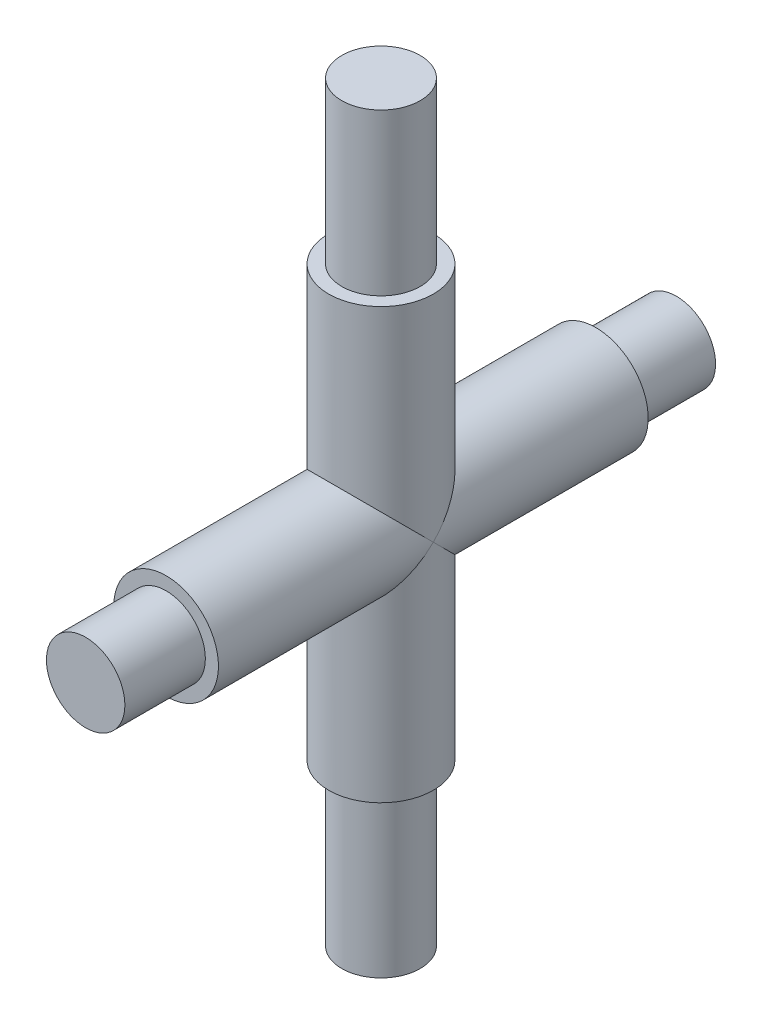
ISO-10303-21;
HEADER;
FILE_DESCRIPTION(('STEP AP214'),'2;1');
FILE_NAME('part.step','',(''),(''),'','','');
FILE_SCHEMA(('AUTOMOTIVE_DESIGN { 1 0 10303 214 1 1 1 1 }'));
ENDSEC;
DATA;
#1=APPLICATION_CONTEXT('core data for automotive mechanical design processes');
#2=APPLICATION_PROTOCOL_DEFINITION('international standard','automotive_design',2000,#1);
#3=PRODUCT_CONTEXT('',#1,'mechanical');
#4=PRODUCT('Part','Part','',(#3));
#5=PRODUCT_RELATED_PRODUCT_CATEGORY('part','',(#4));
#6=PRODUCT_DEFINITION_FORMATION('','',#4);
#7=PRODUCT_DEFINITION_CONTEXT('part definition',#1,'design');
#8=PRODUCT_DEFINITION('design','',#6,#7);
#9=PRODUCT_DEFINITION_SHAPE('','',#8);
#10=(LENGTH_UNIT() NAMED_UNIT(*) SI_UNIT(.MILLI.,.METRE.));
#11=(NAMED_UNIT(*) PLANE_ANGLE_UNIT() SI_UNIT($,.RADIAN.));
#12=(NAMED_UNIT(*) SI_UNIT($,.STERADIAN.) SOLID_ANGLE_UNIT());
#13=UNCERTAINTY_MEASURE_WITH_UNIT(LENGTH_MEASURE(1.E-05),#10,'distance_accuracy_value','');
#14=(GEOMETRIC_REPRESENTATION_CONTEXT(3) GLOBAL_UNCERTAINTY_ASSIGNED_CONTEXT((#13)) GLOBAL_UNIT_ASSIGNED_CONTEXT((#10,
#11,#12)) REPRESENTATION_CONTEXT('',''));
#15=CARTESIAN_POINT('',(0.,0.,0.));
#16=DIRECTION('',(0.,0.,1.));
#17=DIRECTION('',(1.,0.,0.));
#18=AXIS2_PLACEMENT_3D('',#15,#16,#17);
#19=CARTESIAN_POINT('',(0.,53.4,0.));
#20=DIRECTION('',(0.,-1.,0.));
#21=DIRECTION('',(0.,0.,-1.));
#22=AXIS2_PLACEMENT_3D('',#19,#20,#21);
#23=CYLINDRICAL_SURFACE('',#22,6.5);
#24=CARTESIAN_POINT('',(0.,26.7,0.));
#25=DIRECTION('',(0.,-0.707106781186547,0.707106781186547));
#26=DIRECTION('',(0.,-0.707106781186547,-0.707106781186547));
#27=AXIS2_PLACEMENT_3D('',#24,#25,#26);
#28=ELLIPSE('',#27,9.19238815542512,6.5);
#29=CARTESIAN_POINT('',(-6.5,26.7,0.));
#30=VERTEX_POINT('',#29);
#31=CARTESIAN_POINT('',(6.5,26.7,0.));
#32=VERTEX_POINT('',#31);
#33=EDGE_CURVE('E57',#30,#32,#28,.T.);
#34=ORIENTED_EDGE('',*,*,#33,.T.);
#35=CARTESIAN_POINT('',(0.,26.7,0.));
#36=DIRECTION('',(0.,-0.707106781186547,-0.707106781186547));
#37=DIRECTION('',(0.,-0.707106781186547,0.707106781186547));
#38=AXIS2_PLACEMENT_3D('',#35,#36,#37);
#39=ELLIPSE('',#38,9.19238815542512,6.5);
#40=EDGE_CURVE('E61',#32,#30,#39,.T.);
#41=ORIENTED_EDGE('',*,*,#40,.T.);
#42=EDGE_LOOP('',(#34,#41));
#43=FACE_BOUND('',#42,.T.);
#44=CARTESIAN_POINT('',(0.,0.,0.));
#45=DIRECTION('',(0.,1.,0.));
#46=DIRECTION('',(0.,0.,1.));
#47=AXIS2_PLACEMENT_3D('',#44,#45,#46);
#48=CIRCLE('',#47,6.5);
#49=CARTESIAN_POINT('',(0.,0.,6.5));
#50=VERTEX_POINT('',#49);
#51=EDGE_CURVE('E70',#50,#50,#48,.T.);
#52=ORIENTED_EDGE('',*,*,#51,.T.);
#53=EDGE_LOOP('',(#52));
#54=FACE_BOUND('',#53,.T.);
#55=ADVANCED_FACE('F36',(#43,#54),#23,.T.);
#56=CARTESIAN_POINT('',(0.,0.,0.));
#57=DIRECTION('',(0.,1.,0.));
#58=DIRECTION('',(0.,0.,1.));
#59=AXIS2_PLACEMENT_3D('',#56,#57,#58);
#60=PLANE('',#59);
#61=CARTESIAN_POINT('',(0.,0.,0.));
#62=DIRECTION('',(0.,-1.,0.));
#63=DIRECTION('',(0.,0.,-1.));
#64=AXIS2_PLACEMENT_3D('',#61,#62,#63);
#65=CIRCLE('',#64,4.875);
#66=CARTESIAN_POINT('',(0.,0.,-4.875));
#67=VERTEX_POINT('',#66);
#68=EDGE_CURVE('E77',#67,#67,#65,.T.);
#69=ORIENTED_EDGE('',*,*,#68,.F.);
#70=EDGE_LOOP('',(#69));
#71=FACE_BOUND('',#70,.T.);
#72=ORIENTED_EDGE('',*,*,#51,.F.);
#73=EDGE_LOOP('',(#72));
#74=FACE_BOUND('',#73,.T.);
#75=ADVANCED_FACE('F127',(#71,#74),#60,.F.);
#76=CARTESIAN_POINT('',(0.,-20.,0.));
#77=DIRECTION('',(0.,1.,0.));
#78=DIRECTION('',(0.,0.,1.));
#79=AXIS2_PLACEMENT_3D('',#76,#77,#78);
#80=CYLINDRICAL_SURFACE('',#79,4.875);
#81=CARTESIAN_POINT('',(0.,-20.,0.));
#82=DIRECTION('',(0.,-1.,0.));
#83=DIRECTION('',(0.,0.,-1.));
#84=AXIS2_PLACEMENT_3D('',#81,#82,#83);
#85=CIRCLE('',#84,4.875);
#86=CARTESIAN_POINT('',(0.,-20.,-4.875));
#87=VERTEX_POINT('',#86);
#88=EDGE_CURVE('E74',#87,#87,#85,.T.);
#89=ORIENTED_EDGE('',*,*,#88,.F.);
#90=EDGE_LOOP('',(#89));
#91=FACE_BOUND('',#90,.T.);
#92=ORIENTED_EDGE('',*,*,#68,.T.);
#93=EDGE_LOOP('',(#92));
#94=FACE_BOUND('',#93,.T.);
#95=ADVANCED_FACE('F131',(#91,#94),#80,.T.);
#96=CARTESIAN_POINT('',(0.,-20.,0.));
#97=DIRECTION('',(0.,-1.,0.));
#98=DIRECTION('',(0.,0.,-1.));
#99=AXIS2_PLACEMENT_3D('',#96,#97,#98);
#100=PLANE('',#99);
#101=ORIENTED_EDGE('',*,*,#88,.T.);
#102=EDGE_LOOP('',(#101));
#103=FACE_BOUND('',#102,.T.);
#104=ADVANCED_FACE('F114',(#103),#100,.T.);
#105=CARTESIAN_POINT('',(0.,26.7,26.7));
#106=DIRECTION('',(0.,0.,-1.));
#107=DIRECTION('',(-1.,0.,0.));
#108=AXIS2_PLACEMENT_3D('',#105,#106,#107);
#109=PLANE('',#108);
#110=CARTESIAN_POINT('',(0.,26.7,26.7));
#111=DIRECTION('',(0.,0.,1.));
#112=DIRECTION('',(1.,0.,0.));
#113=AXIS2_PLACEMENT_3D('',#110,#111,#112);
#114=CIRCLE('',#113,4.875);
#115=CARTESIAN_POINT('',(4.875,26.7,26.7));
#116=VERTEX_POINT('',#115);
#117=EDGE_CURVE('E11',#116,#116,#114,.T.);
#118=ORIENTED_EDGE('',*,*,#117,.F.);
#119=EDGE_LOOP('',(#118));
#120=FACE_BOUND('',#119,.T.);
#121=CARTESIAN_POINT('',(0.,26.7,26.7));
#122=DIRECTION('',(0.,0.,-1.));
#123=DIRECTION('',(-1.,0.,0.));
#124=AXIS2_PLACEMENT_3D('',#121,#122,#123);
#125=CIRCLE('',#124,6.5);
#126=CARTESIAN_POINT('',(-6.5,26.7,26.7));
#127=VERTEX_POINT('',#126);
#128=EDGE_CURVE('E87',#127,#127,#125,.T.);
#129=ORIENTED_EDGE('',*,*,#128,.F.);
#130=EDGE_LOOP('',(#129));
#131=FACE_BOUND('',#130,.T.);
#132=ADVANCED_FACE('F111',(#120,#131),#109,.F.);
#133=CARTESIAN_POINT('',(0.,26.7,26.7));
#134=DIRECTION('',(0.,0.,-1.));
#135=DIRECTION('',(-1.,0.,0.));
#136=AXIS2_PLACEMENT_3D('',#133,#134,#135);
#137=CYLINDRICAL_SURFACE('',#136,6.5);
#138=ORIENTED_EDGE('',*,*,#128,.T.);
#139=EDGE_LOOP('',(#138));
#140=FACE_BOUND('',#139,.T.);
#141=ORIENTED_EDGE('',*,*,#40,.F.);
#142=CARTESIAN_POINT('',(0.,26.7,0.));
#143=DIRECTION('',(0.,-0.707106781186547,0.707106781186547));
#144=DIRECTION('',(0.,-0.707106781186547,-0.707106781186547));
#145=AXIS2_PLACEMENT_3D('',#142,#143,#144);
#146=ELLIPSE('',#145,9.19238815542512,6.5);
#147=EDGE_CURVE('E51',#30,#32,#146,.F.);
#148=ORIENTED_EDGE('',*,*,#147,.F.);
#149=EDGE_LOOP('',(#141,#148));
#150=FACE_BOUND('',#149,.T.);
#151=ADVANCED_FACE('F64',(#140,#150),#137,.T.);
#152=CARTESIAN_POINT('',(0.,26.7,-26.7));
#153=DIRECTION('',(0.,0.,-1.));
#154=DIRECTION('',(-1.,0.,0.));
#155=AXIS2_PLACEMENT_3D('',#152,#153,#154);
#156=CIRCLE('',#155,6.5);
#157=CARTESIAN_POINT('',(-6.5,26.7,-26.7));
#158=VERTEX_POINT('',#157);
#159=EDGE_CURVE('E90',#158,#158,#156,.T.);
#160=ORIENTED_EDGE('',*,*,#159,.F.);
#161=EDGE_LOOP('',(#160));
#162=FACE_BOUND('',#161,.T.);
#163=CARTESIAN_POINT('',(0.,26.7,0.));
#164=DIRECTION('',(0.,-0.707106781186547,-0.707106781186547));
#165=DIRECTION('',(0.,-0.707106781186547,0.707106781186547));
#166=AXIS2_PLACEMENT_3D('',#163,#164,#165);
#167=ELLIPSE('',#166,9.19238815542512,6.5);
#168=EDGE_CURVE('E39',#32,#30,#167,.F.);
#169=ORIENTED_EDGE('',*,*,#168,.F.);
#170=ORIENTED_EDGE('',*,*,#33,.F.);
#171=EDGE_LOOP('',(#169,#170));
#172=FACE_BOUND('',#171,.T.);
#173=ADVANCED_FACE('F58',(#162,#172),#137,.T.);
#174=CARTESIAN_POINT('',(0.,26.7,-26.7));
#175=DIRECTION('',(0.,0.,-1.));
#176=DIRECTION('',(-1.,0.,0.));
#177=AXIS2_PLACEMENT_3D('',#174,#175,#176);
#178=PLANE('',#177);
#179=CARTESIAN_POINT('',(0.,26.7,-26.7));
#180=DIRECTION('',(0.,0.,-1.));
#181=DIRECTION('',(-1.,0.,0.));
#182=AXIS2_PLACEMENT_3D('',#179,#180,#181);
#183=CIRCLE('',#182,4.875);
#184=CARTESIAN_POINT('',(-4.875,26.7,-26.7));
#185=VERTEX_POINT('',#184);
#186=EDGE_CURVE('E44',#185,#185,#183,.T.);
#187=ORIENTED_EDGE('',*,*,#186,.F.);
#188=EDGE_LOOP('',(#187));
#189=FACE_BOUND('',#188,.T.);
#190=ORIENTED_EDGE('',*,*,#159,.T.);
#191=EDGE_LOOP('',(#190));
#192=FACE_BOUND('',#191,.T.);
#193=ADVANCED_FACE('F123',(#189,#192),#178,.T.);
#194=CARTESIAN_POINT('',(0.,73.4,0.));
#195=DIRECTION('',(0.,1.,0.));
#196=DIRECTION('',(0.,0.,1.));
#197=AXIS2_PLACEMENT_3D('',#194,#195,#196);
#198=PLANE('',#197);
#199=CARTESIAN_POINT('',(0.,73.4,0.));
#200=DIRECTION('',(0.,1.,0.));
#201=DIRECTION('',(0.,0.,1.));
#202=AXIS2_PLACEMENT_3D('',#199,#200,#201);
#203=CIRCLE('',#202,4.875);
#204=CARTESIAN_POINT('',(0.,73.4,4.875));
#205=VERTEX_POINT('',#204);
#206=EDGE_CURVE('E82',#205,#205,#203,.T.);
#207=ORIENTED_EDGE('',*,*,#206,.T.);
#208=EDGE_LOOP('',(#207));
#209=FACE_BOUND('',#208,.T.);
#210=ADVANCED_FACE('F151',(#209),#198,.T.);
#211=CARTESIAN_POINT('',(0.,73.4,0.));
#212=DIRECTION('',(0.,-1.,0.));
#213=DIRECTION('',(0.,0.,-1.));
#214=AXIS2_PLACEMENT_3D('',#211,#212,#213);
#215=CYLINDRICAL_SURFACE('',#214,4.875);
#216=ORIENTED_EDGE('',*,*,#206,.F.);
#217=EDGE_LOOP('',(#216));
#218=FACE_BOUND('',#217,.T.);
#219=CARTESIAN_POINT('',(0.,53.4,0.));
#220=DIRECTION('',(0.,1.,0.));
#221=DIRECTION('',(0.,0.,1.));
#222=AXIS2_PLACEMENT_3D('',#219,#220,#221);
#223=CIRCLE('',#222,4.875);
#224=CARTESIAN_POINT('',(0.,53.4,4.875));
#225=VERTEX_POINT('',#224);
#226=EDGE_CURVE('E65',#225,#225,#223,.T.);
#227=ORIENTED_EDGE('',*,*,#226,.T.);
#228=EDGE_LOOP('',(#227));
#229=FACE_BOUND('',#228,.T.);
#230=ADVANCED_FACE('F143',(#218,#229),#215,.T.);
#231=CARTESIAN_POINT('',(0.,53.4,0.));
#232=DIRECTION('',(0.,1.,0.));
#233=DIRECTION('',(0.,0.,1.));
#234=AXIS2_PLACEMENT_3D('',#231,#232,#233);
#235=PLANE('',#234);
#236=ORIENTED_EDGE('',*,*,#226,.F.);
#237=EDGE_LOOP('',(#236));
#238=FACE_BOUND('',#237,.T.);
#239=CARTESIAN_POINT('',(0.,53.4,0.));
#240=DIRECTION('',(0.,1.,0.));
#241=DIRECTION('',(0.,0.,1.));
#242=AXIS2_PLACEMENT_3D('',#239,#240,#241);
#243=CIRCLE('',#242,6.5);
#244=CARTESIAN_POINT('',(0.,53.4,6.5));
#245=VERTEX_POINT('',#244);
#246=EDGE_CURVE('E73',#245,#245,#243,.T.);
#247=ORIENTED_EDGE('',*,*,#246,.T.);
#248=EDGE_LOOP('',(#247));
#249=FACE_BOUND('',#248,.T.);
#250=ADVANCED_FACE('F135',(#238,#249),#235,.T.);
#251=ORIENTED_EDGE('',*,*,#246,.F.);
#252=EDGE_LOOP('',(#251));
#253=FACE_BOUND('',#252,.T.);
#254=ORIENTED_EDGE('',*,*,#147,.T.);
#255=ORIENTED_EDGE('',*,*,#168,.T.);
#256=EDGE_LOOP('',(#254,#255));
#257=FACE_BOUND('',#256,.T.);
#258=ADVANCED_FACE('F67',(#253,#257),#23,.T.);
#259=CARTESIAN_POINT('',(0.,26.7,-36.7));
#260=DIRECTION('',(0.,0.,1.));
#261=DIRECTION('',(1.,0.,0.));
#262=AXIS2_PLACEMENT_3D('',#259,#260,#261);
#263=CYLINDRICAL_SURFACE('',#262,4.875);
#264=CARTESIAN_POINT('',(0.,26.7,-36.7));
#265=DIRECTION('',(0.,0.,-1.));
#266=DIRECTION('',(-1.,0.,0.));
#267=AXIS2_PLACEMENT_3D('',#264,#265,#266);
#268=CIRCLE('',#267,4.875);
#269=CARTESIAN_POINT('',(-4.875,26.7,-36.7));
#270=VERTEX_POINT('',#269);
#271=EDGE_CURVE('E93',#270,#270,#268,.T.);
#272=ORIENTED_EDGE('',*,*,#271,.F.);
#273=EDGE_LOOP('',(#272));
#274=FACE_BOUND('',#273,.T.);
#275=ORIENTED_EDGE('',*,*,#186,.T.);
#276=EDGE_LOOP('',(#275));
#277=FACE_BOUND('',#276,.T.);
#278=ADVANCED_FACE('F134',(#274,#277),#263,.T.);
#279=CARTESIAN_POINT('',(0.,26.7,-36.7));
#280=DIRECTION('',(0.,0.,-1.));
#281=DIRECTION('',(-1.,0.,0.));
#282=AXIS2_PLACEMENT_3D('',#279,#280,#281);
#283=PLANE('',#282);
#284=ORIENTED_EDGE('',*,*,#271,.T.);
#285=EDGE_LOOP('',(#284));
#286=FACE_BOUND('',#285,.T.);
#287=ADVANCED_FACE('F107',(#286),#283,.T.);
#288=CARTESIAN_POINT('',(0.,26.7,36.7));
#289=DIRECTION('',(0.,0.,-1.));
#290=DIRECTION('',(-1.,0.,0.));
#291=AXIS2_PLACEMENT_3D('',#288,#289,#290);
#292=CYLINDRICAL_SURFACE('',#291,4.875);
#293=CARTESIAN_POINT('',(0.,26.7,36.7));
#294=DIRECTION('',(0.,0.,1.));
#295=DIRECTION('',(1.,0.,0.));
#296=AXIS2_PLACEMENT_3D('',#293,#294,#295);
#297=CIRCLE('',#296,4.875);
#298=CARTESIAN_POINT('',(4.875,26.7,36.7));
#299=VERTEX_POINT('',#298);
#300=EDGE_CURVE('E97',#299,#299,#297,.T.);
#301=ORIENTED_EDGE('',*,*,#300,.F.);
#302=EDGE_LOOP('',(#301));
#303=FACE_BOUND('',#302,.T.);
#304=ORIENTED_EDGE('',*,*,#117,.T.);
#305=EDGE_LOOP('',(#304));
#306=FACE_BOUND('',#305,.T.);
#307=ADVANCED_FACE('F104',(#303,#306),#292,.T.);
#308=CARTESIAN_POINT('',(0.,26.7,36.7));
#309=DIRECTION('',(0.,0.,1.));
#310=DIRECTION('',(1.,0.,0.));
#311=AXIS2_PLACEMENT_3D('',#308,#309,#310);
#312=PLANE('',#311);
#313=ORIENTED_EDGE('',*,*,#300,.T.);
#314=EDGE_LOOP('',(#313));
#315=FACE_BOUND('',#314,.T.);
#316=ADVANCED_FACE('F102',(#315),#312,.T.);
#317=CLOSED_SHELL('',(#55,#75,#95,#104,#132,#151,#173,#193,#210,#230,#250,#258,#278,#287,#307,#316));
#318=MANIFOLD_SOLID_BREP('B2',#317);
#319=ADVANCED_BREP_SHAPE_REPRESENTATION('',(#18,#318),#14);
#320=SHAPE_DEFINITION_REPRESENTATION(#9,#319);
ENDSEC;
END-ISO-10303-21;
